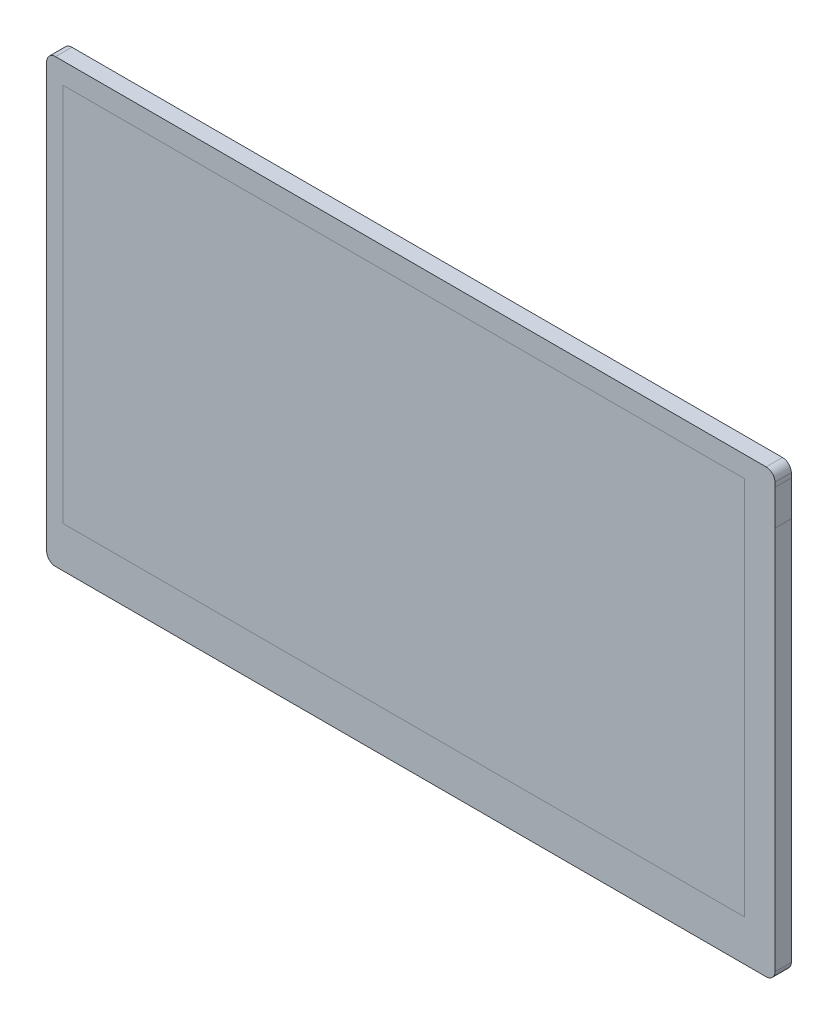
ISO-10303-21;
HEADER;
FILE_DESCRIPTION(('STEP AP214'),'2;1');
FILE_NAME('part.step','',(''),(''),'','','');
FILE_SCHEMA(('AUTOMOTIVE_DESIGN { 1 0 10303 214 1 1 1 1 }'));
ENDSEC;
DATA;
#1=APPLICATION_CONTEXT('core data for automotive mechanical design processes');
#2=APPLICATION_PROTOCOL_DEFINITION('international standard','automotive_design',2000,#1);
#3=PRODUCT_CONTEXT('',#1,'mechanical');
#4=PRODUCT('Part','Part','',(#3));
#5=PRODUCT_RELATED_PRODUCT_CATEGORY('part','',(#4));
#6=PRODUCT_DEFINITION_FORMATION('','',#4);
#7=PRODUCT_DEFINITION_CONTEXT('part definition',#1,'design');
#8=PRODUCT_DEFINITION('design','',#6,#7);
#9=PRODUCT_DEFINITION_SHAPE('','',#8);
#10=(LENGTH_UNIT() NAMED_UNIT(*) SI_UNIT(.MILLI.,.METRE.));
#11=(NAMED_UNIT(*) PLANE_ANGLE_UNIT() SI_UNIT($,.RADIAN.));
#12=(NAMED_UNIT(*) SI_UNIT($,.STERADIAN.) SOLID_ANGLE_UNIT());
#13=UNCERTAINTY_MEASURE_WITH_UNIT(LENGTH_MEASURE(1.E-05),#10,'distance_accuracy_value','');
#14=(GEOMETRIC_REPRESENTATION_CONTEXT(3) GLOBAL_UNCERTAINTY_ASSIGNED_CONTEXT((#13)) GLOBAL_UNIT_ASSIGNED_CONTEXT((#10,
#11,#12)) REPRESENTATION_CONTEXT('',''));
#15=CARTESIAN_POINT('',(0.,0.,0.));
#16=DIRECTION('',(0.,0.,1.));
#17=DIRECTION('',(1.,0.,0.));
#18=AXIS2_PLACEMENT_3D('',#15,#16,#17);
#19=CARTESIAN_POINT('',(-80.8272,-52.25,0.));
#20=DIRECTION('',(0.,-1.,0.));
#21=DIRECTION('',(0.,0.,-1.));
#22=AXIS2_PLACEMENT_3D('',#19,#20,#21);
#23=PLANE('',#22);
#24=DIRECTION('',(1.,0.,0.));
#25=VECTOR('',#24,1.);
#26=CARTESIAN_POINT('',(-80.8272,-52.25,0.));
#27=LINE('',#26,#25);
#28=CARTESIAN_POINT('',(-78.8272,-52.25,0.));
#29=VERTEX_POINT('',#28);
#30=CARTESIAN_POINT('',(-15.,-52.25,0.));
#31=VERTEX_POINT('',#30);
#32=EDGE_CURVE('E208',#29,#31,#27,.T.);
#33=ORIENTED_EDGE('',*,*,#32,.T.);
#34=DIRECTION('',(0.,0.,1.));
#35=VECTOR('',#34,1.);
#36=CARTESIAN_POINT('',(-15.,-52.25,0.));
#37=LINE('',#36,#35);
#38=CARTESIAN_POINT('',(-15.,-52.25,3.7));
#39=VERTEX_POINT('',#38);
#40=EDGE_CURVE('E12',#31,#39,#37,.T.);
#41=ORIENTED_EDGE('',*,*,#40,.T.);
#42=DIRECTION('',(1.,0.,0.));
#43=VECTOR('',#42,1.);
#44=CARTESIAN_POINT('',(-80.8272,-52.25,3.7));
#45=LINE('',#44,#43);
#46=CARTESIAN_POINT('',(-78.8272,-52.25,3.7));
#47=VERTEX_POINT('',#46);
#48=EDGE_CURVE('E223',#47,#39,#45,.T.);
#49=ORIENTED_EDGE('',*,*,#48,.F.);
#50=DIRECTION('',(0.,0.,1.));
#51=VECTOR('',#50,1.);
#52=CARTESIAN_POINT('',(-78.8272,-52.25,0.));
#53=LINE('',#52,#51);
#54=EDGE_CURVE('E219',#47,#29,#53,.F.);
#55=ORIENTED_EDGE('',*,*,#54,.T.);
#56=EDGE_LOOP('',(#33,#41,#49,#55));
#57=FACE_BOUND('',#56,.T.);
#58=ADVANCED_FACE('F47',(#57),#23,.T.);
#59=CARTESIAN_POINT('',(15.,-52.25,3.7));
#60=VERTEX_POINT('',#59);
#61=CARTESIAN_POINT('',(82.0328,-52.25,3.7));
#62=VERTEX_POINT('',#61);
#63=EDGE_CURVE('E222',#60,#62,#45,.T.);
#64=ORIENTED_EDGE('',*,*,#63,.F.);
#65=DIRECTION('',(0.,0.,-1.));
#66=VECTOR('',#65,1.);
#67=CARTESIAN_POINT('',(15.,-52.25,0.));
#68=LINE('',#67,#66);
#69=CARTESIAN_POINT('',(15.,-52.25,0.));
#70=VERTEX_POINT('',#69);
#71=EDGE_CURVE('E56',#60,#70,#68,.T.);
#72=ORIENTED_EDGE('',*,*,#71,.T.);
#73=CARTESIAN_POINT('',(82.0328,-52.25,0.));
#74=VERTEX_POINT('',#73);
#75=EDGE_CURVE('E206',#70,#74,#27,.T.);
#76=ORIENTED_EDGE('',*,*,#75,.T.);
#77=DIRECTION('',(0.,0.,1.));
#78=VECTOR('',#77,1.);
#79=CARTESIAN_POINT('',(82.0328,-52.25,0.));
#80=LINE('',#79,#78);
#81=EDGE_CURVE('E235',#74,#62,#80,.T.);
#82=ORIENTED_EDGE('',*,*,#81,.T.);
#83=EDGE_LOOP('',(#64,#72,#76,#82));
#84=FACE_BOUND('',#83,.T.);
#85=ADVANCED_FACE('F281',(#84),#23,.T.);
#86=CARTESIAN_POINT('',(84.0328,47.71,0.));
#87=DIRECTION('',(1.,0.,0.));
#88=DIRECTION('',(0.,1.,0.));
#89=AXIS2_PLACEMENT_3D('',#86,#87,#88);
#90=PLANE('',#89);
#91=DIRECTION('',(0.,1.,0.));
#92=VECTOR('',#91,1.);
#93=CARTESIAN_POINT('',(84.0328,47.71,0.));
#94=LINE('',#93,#92);
#95=CARTESIAN_POINT('',(84.0328,-50.25,0.));
#96=VERTEX_POINT('',#95);
#97=CARTESIAN_POINT('',(84.0328,36.71,0.));
#98=VERTEX_POINT('',#97);
#99=EDGE_CURVE('E212',#96,#98,#94,.T.);
#100=ORIENTED_EDGE('',*,*,#99,.T.);
#101=DIRECTION('',(0.,0.,1.));
#102=VECTOR('',#101,1.);
#103=CARTESIAN_POINT('',(84.0328,36.71,0.));
#104=LINE('',#103,#102);
#105=CARTESIAN_POINT('',(84.0328,36.71,3.7));
#106=VERTEX_POINT('',#105);
#107=EDGE_CURVE('E274',#98,#106,#104,.T.);
#108=ORIENTED_EDGE('',*,*,#107,.T.);
#109=DIRECTION('',(0.,1.,0.));
#110=VECTOR('',#109,1.);
#111=CARTESIAN_POINT('',(84.0328,47.71,3.7));
#112=LINE('',#111,#110);
#113=CARTESIAN_POINT('',(84.0328,-50.25,3.7));
#114=VERTEX_POINT('',#113);
#115=EDGE_CURVE('E228',#114,#106,#112,.T.);
#116=ORIENTED_EDGE('',*,*,#115,.F.);
#117=DIRECTION('',(0.,0.,1.));
#118=VECTOR('',#117,1.);
#119=CARTESIAN_POINT('',(84.0328,-50.25,0.));
#120=LINE('',#119,#118);
#121=EDGE_CURVE('E249',#114,#96,#120,.F.);
#122=ORIENTED_EDGE('',*,*,#121,.T.);
#123=EDGE_LOOP('',(#100,#108,#116,#122));
#124=FACE_BOUND('',#123,.T.);
#125=ADVANCED_FACE('F325',(#124),#90,.T.);
#126=CARTESIAN_POINT('',(84.0328,44.71,3.7));
#127=VERTEX_POINT('',#126);
#128=CARTESIAN_POINT('',(84.0328,45.71,3.7));
#129=VERTEX_POINT('',#128);
#130=EDGE_CURVE('E226',#127,#129,#112,.T.);
#131=ORIENTED_EDGE('',*,*,#130,.F.);
#132=DIRECTION('',(0.,0.,-1.));
#133=VECTOR('',#132,1.);
#134=CARTESIAN_POINT('',(84.0328,44.71,0.));
#135=LINE('',#134,#133);
#136=CARTESIAN_POINT('',(84.0328,44.71,0.));
#137=VERTEX_POINT('',#136);
#138=EDGE_CURVE('E271',#127,#137,#135,.T.);
#139=ORIENTED_EDGE('',*,*,#138,.T.);
#140=CARTESIAN_POINT('',(84.0328,45.71,0.));
#141=VERTEX_POINT('',#140);
#142=EDGE_CURVE('E210',#137,#141,#94,.T.);
#143=ORIENTED_EDGE('',*,*,#142,.T.);
#144=DIRECTION('',(0.,0.,1.));
#145=VECTOR('',#144,1.);
#146=CARTESIAN_POINT('',(84.0328,45.71,0.));
#147=LINE('',#146,#145);
#148=EDGE_CURVE('E246',#141,#129,#147,.T.);
#149=ORIENTED_EDGE('',*,*,#148,.T.);
#150=EDGE_LOOP('',(#131,#139,#143,#149));
#151=FACE_BOUND('',#150,.T.);
#152=ADVANCED_FACE('F330',(#151),#90,.T.);
#153=CARTESIAN_POINT('',(-80.8272,47.71,0.));
#154=DIRECTION('',(-1.,0.,0.));
#155=DIRECTION('',(0.,-1.,0.));
#156=AXIS2_PLACEMENT_3D('',#153,#154,#155);
#157=PLANE('',#156);
#158=DIRECTION('',(0.,-1.,0.));
#159=VECTOR('',#158,1.);
#160=CARTESIAN_POINT('',(-80.8272,47.71,0.));
#161=LINE('',#160,#159);
#162=CARTESIAN_POINT('',(-80.8272,45.71,0.));
#163=VERTEX_POINT('',#162);
#164=CARTESIAN_POINT('',(-80.8272,-50.25,0.));
#165=VERTEX_POINT('',#164);
#166=EDGE_CURVE('E203',#163,#165,#161,.T.);
#167=ORIENTED_EDGE('',*,*,#166,.T.);
#168=DIRECTION('',(0.,0.,1.));
#169=VECTOR('',#168,1.);
#170=CARTESIAN_POINT('',(-80.8272,-50.25,0.));
#171=LINE('',#170,#169);
#172=CARTESIAN_POINT('',(-80.8272,-50.25,3.7));
#173=VERTEX_POINT('',#172);
#174=EDGE_CURVE('E263',#165,#173,#171,.T.);
#175=ORIENTED_EDGE('',*,*,#174,.T.);
#176=DIRECTION('',(0.,-1.,0.));
#177=VECTOR('',#176,1.);
#178=CARTESIAN_POINT('',(-80.8272,47.71,3.7));
#179=LINE('',#178,#177);
#180=CARTESIAN_POINT('',(-80.8272,45.71,3.7));
#181=VERTEX_POINT('',#180);
#182=EDGE_CURVE('E199',#181,#173,#179,.T.);
#183=ORIENTED_EDGE('',*,*,#182,.F.);
#184=DIRECTION('',(0.,0.,1.));
#185=VECTOR('',#184,1.);
#186=CARTESIAN_POINT('',(-80.8272,45.71,0.));
#187=LINE('',#186,#185);
#188=EDGE_CURVE('E261',#181,#163,#187,.F.);
#189=ORIENTED_EDGE('',*,*,#188,.T.);
#190=EDGE_LOOP('',(#167,#175,#183,#189));
#191=FACE_BOUND('',#190,.T.);
#192=ADVANCED_FACE('F299',(#191),#157,.T.);
#193=CARTESIAN_POINT('',(-80.8272,47.71,0.));
#194=DIRECTION('',(0.,1.,0.));
#195=DIRECTION('',(0.,0.,1.));
#196=AXIS2_PLACEMENT_3D('',#193,#194,#195);
#197=PLANE('',#196);
#198=DIRECTION('',(-1.,0.,0.));
#199=VECTOR('',#198,1.);
#200=CARTESIAN_POINT('',(-80.8272,47.71,3.7));
#201=LINE('',#200,#199);
#202=CARTESIAN_POINT('',(82.0328,47.71,3.7));
#203=VERTEX_POINT('',#202);
#204=CARTESIAN_POINT('',(-78.8272,47.71,3.7));
#205=VERTEX_POINT('',#204);
#206=EDGE_CURVE('E207',#203,#205,#201,.T.);
#207=ORIENTED_EDGE('',*,*,#206,.F.);
#208=DIRECTION('',(0.,0.,1.));
#209=VECTOR('',#208,1.);
#210=CARTESIAN_POINT('',(82.0328,47.71,0.));
#211=LINE('',#210,#209);
#212=CARTESIAN_POINT('',(82.0328,47.71,0.));
#213=VERTEX_POINT('',#212);
#214=EDGE_CURVE('E269',#203,#213,#211,.F.);
#215=ORIENTED_EDGE('',*,*,#214,.T.);
#216=DIRECTION('',(-1.,0.,0.));
#217=VECTOR('',#216,1.);
#218=CARTESIAN_POINT('',(-80.8272,47.71,0.));
#219=LINE('',#218,#217);
#220=CARTESIAN_POINT('',(-78.8272,47.71,0.));
#221=VERTEX_POINT('',#220);
#222=EDGE_CURVE('E215',#213,#221,#219,.T.);
#223=ORIENTED_EDGE('',*,*,#222,.T.);
#224=DIRECTION('',(0.,0.,1.));
#225=VECTOR('',#224,1.);
#226=CARTESIAN_POINT('',(-78.8272,47.71,0.));
#227=LINE('',#226,#225);
#228=EDGE_CURVE('E266',#221,#205,#227,.T.);
#229=ORIENTED_EDGE('',*,*,#228,.T.);
#230=EDGE_LOOP('',(#207,#215,#223,#229));
#231=FACE_BOUND('',#230,.T.);
#232=ADVANCED_FACE('F308',(#231),#197,.T.);
#233=ORIENTED_EDGE('',*,*,#107,.F.);
#234=EDGE_CURVE('E216',#98,#137,#94,.T.);
#235=ORIENTED_EDGE('',*,*,#234,.T.);
#236=ORIENTED_EDGE('',*,*,#138,.F.);
#237=EDGE_CURVE('E231',#106,#127,#112,.T.);
#238=ORIENTED_EDGE('',*,*,#237,.F.);
#239=EDGE_LOOP('',(#233,#235,#236,#238));
#240=FACE_BOUND('',#239,.T.);
#241=ADVANCED_FACE('F319',(#240),#90,.T.);
#242=ORIENTED_EDGE('',*,*,#40,.F.);
#243=EDGE_CURVE('E211',#31,#70,#27,.T.);
#244=ORIENTED_EDGE('',*,*,#243,.T.);
#245=ORIENTED_EDGE('',*,*,#71,.F.);
#246=EDGE_CURVE('E227',#39,#60,#45,.T.);
#247=ORIENTED_EDGE('',*,*,#246,.F.);
#248=EDGE_LOOP('',(#242,#244,#245,#247));
#249=FACE_BOUND('',#248,.T.);
#250=ADVANCED_FACE('F288',(#249),#23,.T.);
#251=CARTESIAN_POINT('',(0.,0.,0.));
#252=DIRECTION('',(0.,0.,1.));
#253=DIRECTION('',(1.,0.,0.));
#254=AXIS2_PLACEMENT_3D('',#251,#252,#253);
#255=PLANE('',#254);
#256=DIRECTION('',(-1.,0.,0.));
#257=VECTOR('',#256,1.);
#258=CARTESIAN_POINT('',(-77.1072,42.96,0.));
#259=LINE('',#258,#257);
#260=CARTESIAN_POINT('',(77.1072,42.96,0.));
#261=VERTEX_POINT('',#260);
#262=CARTESIAN_POINT('',(-77.1072,42.96,0.));
#263=VERTEX_POINT('',#262);
#264=EDGE_CURVE('E171',#261,#263,#259,.T.);
#265=ORIENTED_EDGE('',*,*,#264,.T.);
#266=DIRECTION('',(0.,-1.,0.));
#267=VECTOR('',#266,1.);
#268=CARTESIAN_POINT('',(-77.1072,42.96,0.));
#269=LINE('',#268,#267);
#270=CARTESIAN_POINT('',(-77.1072,-42.96,0.));
#271=VERTEX_POINT('',#270);
#272=EDGE_CURVE('E163',#263,#271,#269,.T.);
#273=ORIENTED_EDGE('',*,*,#272,.T.);
#274=DIRECTION('',(1.,0.,0.));
#275=VECTOR('',#274,1.);
#276=CARTESIAN_POINT('',(-77.1072,-42.96,0.));
#277=LINE('',#276,#275);
#278=CARTESIAN_POINT('',(77.1072,-42.96,0.));
#279=VERTEX_POINT('',#278);
#280=EDGE_CURVE('E175',#271,#279,#277,.T.);
#281=ORIENTED_EDGE('',*,*,#280,.T.);
#282=DIRECTION('',(0.,1.,0.));
#283=VECTOR('',#282,1.);
#284=CARTESIAN_POINT('',(77.1072,42.96,0.));
#285=LINE('',#284,#283);
#286=EDGE_CURVE('E179',#279,#261,#285,.T.);
#287=ORIENTED_EDGE('',*,*,#286,.T.);
#288=EDGE_LOOP('',(#265,#273,#281,#287));
#289=FACE_BOUND('',#288,.T.);
#290=ORIENTED_EDGE('',*,*,#99,.F.);
#291=CARTESIAN_POINT('',(82.0328,-50.25,0.));
#292=DIRECTION('',(0.,0.,1.));
#293=DIRECTION('',(1.,0.,0.));
#294=AXIS2_PLACEMENT_3D('',#291,#292,#293);
#295=CIRCLE('',#294,2.);
#296=EDGE_CURVE('E258',#96,#74,#295,.F.);
#297=ORIENTED_EDGE('',*,*,#296,.T.);
#298=ORIENTED_EDGE('',*,*,#75,.F.);
#299=ORIENTED_EDGE('',*,*,#243,.F.);
#300=ORIENTED_EDGE('',*,*,#32,.F.);
#301=CARTESIAN_POINT('',(-78.8272,-50.25,0.));
#302=DIRECTION('',(0.,0.,1.));
#303=DIRECTION('',(1.,0.,0.));
#304=AXIS2_PLACEMENT_3D('',#301,#302,#303);
#305=CIRCLE('',#304,2.);
#306=EDGE_CURVE('E256',#29,#165,#305,.F.);
#307=ORIENTED_EDGE('',*,*,#306,.T.);
#308=ORIENTED_EDGE('',*,*,#166,.F.);
#309=CARTESIAN_POINT('',(-78.8272,45.71,0.));
#310=DIRECTION('',(0.,0.,1.));
#311=DIRECTION('',(1.,0.,0.));
#312=AXIS2_PLACEMENT_3D('',#309,#310,#311);
#313=CIRCLE('',#312,2.);
#314=EDGE_CURVE('E251',#163,#221,#313,.F.);
#315=ORIENTED_EDGE('',*,*,#314,.T.);
#316=ORIENTED_EDGE('',*,*,#222,.F.);
#317=CARTESIAN_POINT('',(82.0328,45.71,0.));
#318=DIRECTION('',(0.,0.,1.));
#319=DIRECTION('',(1.,0.,0.));
#320=AXIS2_PLACEMENT_3D('',#317,#318,#319);
#321=CIRCLE('',#320,2.);
#322=EDGE_CURVE('E253',#213,#141,#321,.F.);
#323=ORIENTED_EDGE('',*,*,#322,.T.);
#324=ORIENTED_EDGE('',*,*,#142,.F.);
#325=ORIENTED_EDGE('',*,*,#234,.F.);
#326=EDGE_LOOP('',(#290,#297,#298,#299,#300,#307,#308,#315,#316,#323,#324,#325));
#327=FACE_BOUND('',#326,.T.);
#328=ADVANCED_FACE('F181',(#289,#327),#255,.F.);
#329=CARTESIAN_POINT('',(0.,0.,3.7));
#330=DIRECTION('',(0.,0.,1.));
#331=DIRECTION('',(1.,0.,0.));
#332=AXIS2_PLACEMENT_3D('',#329,#330,#331);
#333=PLANE('',#332);
#334=DIRECTION('',(0.,-1.,0.));
#335=VECTOR('',#334,1.);
#336=CARTESIAN_POINT('',(-77.1072,42.96,3.7));
#337=LINE('',#336,#335);
#338=CARTESIAN_POINT('',(-77.1072,42.96,3.7));
#339=VERTEX_POINT('',#338);
#340=CARTESIAN_POINT('',(-77.1072,-42.96,3.7));
#341=VERTEX_POINT('',#340);
#342=EDGE_CURVE('E166',#339,#341,#337,.T.);
#343=ORIENTED_EDGE('',*,*,#342,.F.);
#344=DIRECTION('',(-1.,0.,0.));
#345=VECTOR('',#344,1.);
#346=CARTESIAN_POINT('',(-77.1072,42.96,3.7));
#347=LINE('',#346,#345);
#348=CARTESIAN_POINT('',(77.1072,42.96,3.7));
#349=VERTEX_POINT('',#348);
#350=EDGE_CURVE('E184',#349,#339,#347,.T.);
#351=ORIENTED_EDGE('',*,*,#350,.F.);
#352=DIRECTION('',(0.,1.,0.));
#353=VECTOR('',#352,1.);
#354=CARTESIAN_POINT('',(77.1072,42.96,3.7));
#355=LINE('',#354,#353);
#356=CARTESIAN_POINT('',(77.1072,-42.96,3.7));
#357=VERTEX_POINT('',#356);
#358=EDGE_CURVE('E187',#357,#349,#355,.T.);
#359=ORIENTED_EDGE('',*,*,#358,.F.);
#360=DIRECTION('',(1.,0.,0.));
#361=VECTOR('',#360,1.);
#362=CARTESIAN_POINT('',(-77.1072,-42.96,3.7));
#363=LINE('',#362,#361);
#364=EDGE_CURVE('E193',#341,#357,#363,.T.);
#365=ORIENTED_EDGE('',*,*,#364,.F.);
#366=EDGE_LOOP('',(#343,#351,#359,#365));
#367=FACE_BOUND('',#366,.T.);
#368=ORIENTED_EDGE('',*,*,#48,.T.);
#369=ORIENTED_EDGE('',*,*,#246,.T.);
#370=ORIENTED_EDGE('',*,*,#63,.T.);
#371=CARTESIAN_POINT('',(82.0328,-50.25,3.7));
#372=DIRECTION('',(0.,0.,1.));
#373=DIRECTION('',(1.,0.,0.));
#374=AXIS2_PLACEMENT_3D('',#371,#372,#373);
#375=CIRCLE('',#374,2.);
#376=EDGE_CURVE('E244',#62,#114,#375,.T.);
#377=ORIENTED_EDGE('',*,*,#376,.T.);
#378=ORIENTED_EDGE('',*,*,#115,.T.);
#379=ORIENTED_EDGE('',*,*,#237,.T.);
#380=ORIENTED_EDGE('',*,*,#130,.T.);
#381=CARTESIAN_POINT('',(82.0328,45.71,3.7));
#382=DIRECTION('',(0.,0.,1.));
#383=DIRECTION('',(1.,0.,0.));
#384=AXIS2_PLACEMENT_3D('',#381,#382,#383);
#385=CIRCLE('',#384,2.);
#386=EDGE_CURVE('E240',#129,#203,#385,.T.);
#387=ORIENTED_EDGE('',*,*,#386,.T.);
#388=ORIENTED_EDGE('',*,*,#206,.T.);
#389=CARTESIAN_POINT('',(-78.8272,45.71,3.7));
#390=DIRECTION('',(0.,0.,1.));
#391=DIRECTION('',(1.,0.,0.));
#392=AXIS2_PLACEMENT_3D('',#389,#390,#391);
#393=CIRCLE('',#392,2.);
#394=EDGE_CURVE('E238',#205,#181,#393,.T.);
#395=ORIENTED_EDGE('',*,*,#394,.T.);
#396=ORIENTED_EDGE('',*,*,#182,.T.);
#397=CARTESIAN_POINT('',(-78.8272,-50.25,3.7));
#398=DIRECTION('',(0.,0.,1.));
#399=DIRECTION('',(1.,0.,0.));
#400=AXIS2_PLACEMENT_3D('',#397,#398,#399);
#401=CIRCLE('',#400,2.);
#402=EDGE_CURVE('E242',#173,#47,#401,.T.);
#403=ORIENTED_EDGE('',*,*,#402,.T.);
#404=EDGE_LOOP('',(#368,#369,#370,#377,#378,#379,#380,#387,#388,#395,#396,#403));
#405=FACE_BOUND('',#404,.T.);
#406=ADVANCED_FACE('F290',(#367,#405),#333,.T.);
#407=CARTESIAN_POINT('',(-77.1072,42.96,0.));
#408=DIRECTION('',(-1.,0.,0.));
#409=DIRECTION('',(0.,0.,1.));
#410=AXIS2_PLACEMENT_3D('',#407,#408,#409);
#411=PLANE('',#410);
#412=ORIENTED_EDGE('',*,*,#342,.T.);
#413=DIRECTION('',(0.,0.,1.));
#414=VECTOR('',#413,1.);
#415=CARTESIAN_POINT('',(-77.1072,-42.96,0.));
#416=LINE('',#415,#414);
#417=EDGE_CURVE('E159',#271,#341,#416,.T.);
#418=ORIENTED_EDGE('',*,*,#417,.F.);
#419=ORIENTED_EDGE('',*,*,#272,.F.);
#420=DIRECTION('',(0.,0.,1.));
#421=VECTOR('',#420,1.);
#422=CARTESIAN_POINT('',(-77.1072,42.96,0.));
#423=LINE('',#422,#421);
#424=EDGE_CURVE('E197',#263,#339,#423,.T.);
#425=ORIENTED_EDGE('',*,*,#424,.T.);
#426=EDGE_LOOP('',(#412,#418,#419,#425));
#427=FACE_BOUND('',#426,.T.);
#428=ADVANCED_FACE('F161',(#427),#411,.F.);
#429=CARTESIAN_POINT('',(-77.1072,42.96,0.));
#430=DIRECTION('',(0.,1.,0.));
#431=DIRECTION('',(0.,0.,1.));
#432=AXIS2_PLACEMENT_3D('',#429,#430,#431);
#433=PLANE('',#432);
#434=ORIENTED_EDGE('',*,*,#350,.T.);
#435=ORIENTED_EDGE('',*,*,#424,.F.);
#436=ORIENTED_EDGE('',*,*,#264,.F.);
#437=DIRECTION('',(0.,0.,1.));
#438=VECTOR('',#437,1.);
#439=CARTESIAN_POINT('',(77.1072,42.96,0.));
#440=LINE('',#439,#438);
#441=EDGE_CURVE('E200',#261,#349,#440,.T.);
#442=ORIENTED_EDGE('',*,*,#441,.T.);
#443=EDGE_LOOP('',(#434,#435,#436,#442));
#444=FACE_BOUND('',#443,.T.);
#445=ADVANCED_FACE('F405',(#444),#433,.F.);
#446=CARTESIAN_POINT('',(77.1072,42.96,0.));
#447=DIRECTION('',(1.,0.,0.));
#448=DIRECTION('',(0.,0.,-1.));
#449=AXIS2_PLACEMENT_3D('',#446,#447,#448);
#450=PLANE('',#449);
#451=ORIENTED_EDGE('',*,*,#358,.T.);
#452=ORIENTED_EDGE('',*,*,#441,.F.);
#453=ORIENTED_EDGE('',*,*,#286,.F.);
#454=DIRECTION('',(0.,0.,1.));
#455=VECTOR('',#454,1.);
#456=CARTESIAN_POINT('',(77.1072,-42.96,0.));
#457=LINE('',#456,#455);
#458=EDGE_CURVE('E170',#279,#357,#457,.T.);
#459=ORIENTED_EDGE('',*,*,#458,.T.);
#460=EDGE_LOOP('',(#451,#452,#453,#459));
#461=FACE_BOUND('',#460,.T.);
#462=ADVANCED_FACE('F410',(#461),#450,.F.);
#463=CARTESIAN_POINT('',(-77.1072,-42.96,0.));
#464=DIRECTION('',(0.,-1.,0.));
#465=DIRECTION('',(0.,0.,-1.));
#466=AXIS2_PLACEMENT_3D('',#463,#464,#465);
#467=PLANE('',#466);
#468=ORIENTED_EDGE('',*,*,#364,.T.);
#469=ORIENTED_EDGE('',*,*,#458,.F.);
#470=ORIENTED_EDGE('',*,*,#280,.F.);
#471=ORIENTED_EDGE('',*,*,#417,.T.);
#472=EDGE_LOOP('',(#468,#469,#470,#471));
#473=FACE_BOUND('',#472,.T.);
#474=ADVANCED_FACE('F176',(#473),#467,.F.);
#475=CARTESIAN_POINT('',(82.0328,-50.25,0.));
#476=DIRECTION('',(0.,0.,1.));
#477=DIRECTION('',(1.,0.,0.));
#478=AXIS2_PLACEMENT_3D('',#475,#476,#477);
#479=CYLINDRICAL_SURFACE('',#478,2.);
#480=ORIENTED_EDGE('',*,*,#296,.F.);
#481=ORIENTED_EDGE('',*,*,#121,.F.);
#482=ORIENTED_EDGE('',*,*,#376,.F.);
#483=ORIENTED_EDGE('',*,*,#81,.F.);
#484=EDGE_LOOP('',(#480,#481,#482,#483));
#485=FACE_BOUND('',#484,.T.);
#486=ADVANCED_FACE('F328',(#485),#479,.T.);
#487=CARTESIAN_POINT('',(-78.8272,-50.25,0.));
#488=DIRECTION('',(0.,0.,1.));
#489=DIRECTION('',(1.,0.,0.));
#490=AXIS2_PLACEMENT_3D('',#487,#488,#489);
#491=CYLINDRICAL_SURFACE('',#490,2.);
#492=ORIENTED_EDGE('',*,*,#306,.F.);
#493=ORIENTED_EDGE('',*,*,#54,.F.);
#494=ORIENTED_EDGE('',*,*,#402,.F.);
#495=ORIENTED_EDGE('',*,*,#174,.F.);
#496=EDGE_LOOP('',(#492,#493,#494,#495));
#497=FACE_BOUND('',#496,.T.);
#498=ADVANCED_FACE('F294',(#497),#491,.T.);
#499=CARTESIAN_POINT('',(82.0328,45.71,0.));
#500=DIRECTION('',(0.,0.,1.));
#501=DIRECTION('',(1.,0.,0.));
#502=AXIS2_PLACEMENT_3D('',#499,#500,#501);
#503=CYLINDRICAL_SURFACE('',#502,2.);
#504=ORIENTED_EDGE('',*,*,#322,.F.);
#505=ORIENTED_EDGE('',*,*,#214,.F.);
#506=ORIENTED_EDGE('',*,*,#386,.F.);
#507=ORIENTED_EDGE('',*,*,#148,.F.);
#508=EDGE_LOOP('',(#504,#505,#506,#507));
#509=FACE_BOUND('',#508,.T.);
#510=ADVANCED_FACE('F312',(#509),#503,.T.);
#511=CARTESIAN_POINT('',(-78.8272,45.71,0.));
#512=DIRECTION('',(0.,0.,1.));
#513=DIRECTION('',(1.,0.,0.));
#514=AXIS2_PLACEMENT_3D('',#511,#512,#513);
#515=CYLINDRICAL_SURFACE('',#514,2.);
#516=ORIENTED_EDGE('',*,*,#314,.F.);
#517=ORIENTED_EDGE('',*,*,#188,.F.);
#518=ORIENTED_EDGE('',*,*,#394,.F.);
#519=ORIENTED_EDGE('',*,*,#228,.F.);
#520=EDGE_LOOP('',(#516,#517,#518,#519));
#521=FACE_BOUND('',#520,.T.);
#522=ADVANCED_FACE('F49',(#521),#515,.T.);
#523=CLOSED_SHELL('',(#58,#85,#125,#152,#192,#232,#241,#250,#328,#406,#428,#445,#462,#474,#486,
#498,#510,#522));
#524=MANIFOLD_SOLID_BREP('B2',#523);
#525=CARTESIAN_POINT('',(-77.1072,-42.96,3.7));
#526=DIRECTION('',(1.,0.,0.));
#527=DIRECTION('',(0.,0.,-1.));
#528=AXIS2_PLACEMENT_3D('',#525,#526,#527);
#529=PLANE('',#528);
#530=DIRECTION('',(0.,-1.,0.));
#531=VECTOR('',#530,1.);
#532=CARTESIAN_POINT('',(-77.1072,-42.96,0.));
#533=LINE('',#532,#531);
#534=CARTESIAN_POINT('',(-77.1072,42.96,0.));
#535=VERTEX_POINT('',#534);
#536=CARTESIAN_POINT('',(-77.1072,-42.96,0.));
#537=VERTEX_POINT('',#536);
#538=EDGE_CURVE('E554',#535,#537,#533,.T.);
#539=ORIENTED_EDGE('',*,*,#538,.T.);
#540=DIRECTION('',(0.,0.,-1.));
#541=VECTOR('',#540,1.);
#542=CARTESIAN_POINT('',(-77.1072,-42.96,3.7));
#543=LINE('',#542,#541);
#544=CARTESIAN_POINT('',(-77.1072,-42.96,3.7));
#545=VERTEX_POINT('',#544);
#546=EDGE_CURVE('E45',#545,#537,#543,.T.);
#547=ORIENTED_EDGE('',*,*,#546,.F.);
#548=DIRECTION('',(0.,-1.,0.));
#549=VECTOR('',#548,1.);
#550=CARTESIAN_POINT('',(-77.1072,-42.96,3.7));
#551=LINE('',#550,#549);
#552=CARTESIAN_POINT('',(-77.1072,42.96,3.7));
#553=VERTEX_POINT('',#552);
#554=EDGE_CURVE('E542',#553,#545,#551,.T.);
#555=ORIENTED_EDGE('',*,*,#554,.F.);
#556=DIRECTION('',(0.,0.,-1.));
#557=VECTOR('',#556,1.);
#558=CARTESIAN_POINT('',(-77.1072,42.96,3.7));
#559=LINE('',#558,#557);
#560=EDGE_CURVE('E550',#553,#535,#559,.T.);
#561=ORIENTED_EDGE('',*,*,#560,.T.);
#562=EDGE_LOOP('',(#539,#547,#555,#561));
#563=FACE_BOUND('',#562,.T.);
#564=ADVANCED_FACE('F491',(#563),#529,.F.);
#565=CARTESIAN_POINT('',(77.1072,-42.96,3.7));
#566=DIRECTION('',(0.,1.,0.));
#567=DIRECTION('',(-1.,0.,0.));
#568=AXIS2_PLACEMENT_3D('',#565,#566,#567);
#569=PLANE('',#568);
#570=DIRECTION('',(1.,0.,0.));
#571=VECTOR('',#570,1.);
#572=CARTESIAN_POINT('',(77.1072,-42.96,0.));
#573=LINE('',#572,#571);
#574=CARTESIAN_POINT('',(77.1072,-42.96,0.));
#575=VERTEX_POINT('',#574);
#576=EDGE_CURVE('E546',#537,#575,#573,.T.);
#577=ORIENTED_EDGE('',*,*,#576,.T.);
#578=DIRECTION('',(0.,0.,-1.));
#579=VECTOR('',#578,1.);
#580=CARTESIAN_POINT('',(77.1072,-42.96,3.7));
#581=LINE('',#580,#579);
#582=CARTESIAN_POINT('',(77.1072,-42.96,3.7));
#583=VERTEX_POINT('',#582);
#584=EDGE_CURVE('E499',#583,#575,#581,.T.);
#585=ORIENTED_EDGE('',*,*,#584,.F.);
#586=DIRECTION('',(1.,0.,0.));
#587=VECTOR('',#586,1.);
#588=CARTESIAN_POINT('',(77.1072,-42.96,3.7));
#589=LINE('',#588,#587);
#590=EDGE_CURVE('E537',#545,#583,#589,.T.);
#591=ORIENTED_EDGE('',*,*,#590,.F.);
#592=ORIENTED_EDGE('',*,*,#546,.T.);
#593=EDGE_LOOP('',(#577,#585,#591,#592));
#594=FACE_BOUND('',#593,.T.);
#595=ADVANCED_FACE('F545',(#594),#569,.F.);
#596=CARTESIAN_POINT('',(77.1072,-42.96,3.7));
#597=DIRECTION('',(-1.,0.,0.));
#598=DIRECTION('',(0.,0.,1.));
#599=AXIS2_PLACEMENT_3D('',#596,#597,#598);
#600=PLANE('',#599);
#601=DIRECTION('',(0.,1.,0.));
#602=VECTOR('',#601,1.);
#603=CARTESIAN_POINT('',(77.1072,-42.96,0.));
#604=LINE('',#603,#602);
#605=CARTESIAN_POINT('',(77.1072,42.96,0.));
#606=VERTEX_POINT('',#605);
#607=EDGE_CURVE('E524',#575,#606,#604,.T.);
#608=ORIENTED_EDGE('',*,*,#607,.T.);
#609=DIRECTION('',(0.,0.,-1.));
#610=VECTOR('',#609,1.);
#611=CARTESIAN_POINT('',(77.1072,42.96,3.7));
#612=LINE('',#611,#610);
#613=CARTESIAN_POINT('',(77.1072,42.96,3.7));
#614=VERTEX_POINT('',#613);
#615=EDGE_CURVE('E547',#614,#606,#612,.T.);
#616=ORIENTED_EDGE('',*,*,#615,.F.);
#617=DIRECTION('',(0.,1.,0.));
#618=VECTOR('',#617,1.);
#619=CARTESIAN_POINT('',(77.1072,-42.96,3.7));
#620=LINE('',#619,#618);
#621=EDGE_CURVE('E540',#583,#614,#620,.T.);
#622=ORIENTED_EDGE('',*,*,#621,.F.);
#623=ORIENTED_EDGE('',*,*,#584,.T.);
#624=EDGE_LOOP('',(#608,#616,#622,#623));
#625=FACE_BOUND('',#624,.T.);
#626=ADVANCED_FACE('F548',(#625),#600,.F.);
#627=CARTESIAN_POINT('',(77.1072,42.96,3.7));
#628=DIRECTION('',(0.,-1.,0.));
#629=DIRECTION('',(1.,0.,0.));
#630=AXIS2_PLACEMENT_3D('',#627,#628,#629);
#631=PLANE('',#630);
#632=DIRECTION('',(-1.,0.,0.));
#633=VECTOR('',#632,1.);
#634=CARTESIAN_POINT('',(77.1072,42.96,0.));
#635=LINE('',#634,#633);
#636=EDGE_CURVE('E530',#606,#535,#635,.T.);
#637=ORIENTED_EDGE('',*,*,#636,.T.);
#638=ORIENTED_EDGE('',*,*,#560,.F.);
#639=DIRECTION('',(-1.,0.,0.));
#640=VECTOR('',#639,1.);
#641=CARTESIAN_POINT('',(77.1072,42.96,3.7));
#642=LINE('',#641,#640);
#643=EDGE_CURVE('E507',#614,#553,#642,.T.);
#644=ORIENTED_EDGE('',*,*,#643,.F.);
#645=ORIENTED_EDGE('',*,*,#615,.T.);
#646=EDGE_LOOP('',(#637,#638,#644,#645));
#647=FACE_BOUND('',#646,.T.);
#648=ADVANCED_FACE('F561',(#647),#631,.F.);
#649=CARTESIAN_POINT('',(0.,0.,3.7));
#650=DIRECTION('',(0.,0.,1.));
#651=DIRECTION('',(1.,0.,0.));
#652=AXIS2_PLACEMENT_3D('',#649,#650,#651);
#653=PLANE('',#652);
#654=ORIENTED_EDGE('',*,*,#554,.T.);
#655=ORIENTED_EDGE('',*,*,#590,.T.);
#656=ORIENTED_EDGE('',*,*,#621,.T.);
#657=ORIENTED_EDGE('',*,*,#643,.T.);
#658=EDGE_LOOP('',(#654,#655,#656,#657));
#659=FACE_BOUND('',#658,.T.);
#660=ADVANCED_FACE('F538',(#659),#653,.T.);
#661=CARTESIAN_POINT('',(0.,0.,0.));
#662=DIRECTION('',(0.,0.,1.));
#663=DIRECTION('',(1.,0.,0.));
#664=AXIS2_PLACEMENT_3D('',#661,#662,#663);
#665=PLANE('',#664);
#666=ORIENTED_EDGE('',*,*,#538,.F.);
#667=ORIENTED_EDGE('',*,*,#636,.F.);
#668=ORIENTED_EDGE('',*,*,#607,.F.);
#669=ORIENTED_EDGE('',*,*,#576,.F.);
#670=EDGE_LOOP('',(#666,#667,#668,#669));
#671=FACE_BOUND('',#670,.T.);
#672=ADVANCED_FACE('F564',(#671),#665,.F.);
#673=CLOSED_SHELL('',(#564,#595,#626,#648,#660,#672));
#674=MANIFOLD_SOLID_BREP('B6',#673);
#675=ADVANCED_BREP_SHAPE_REPRESENTATION('',(#18,#524,#674),#14);
#676=SHAPE_DEFINITION_REPRESENTATION(#9,#675);
ENDSEC;
END-ISO-10303-21;
